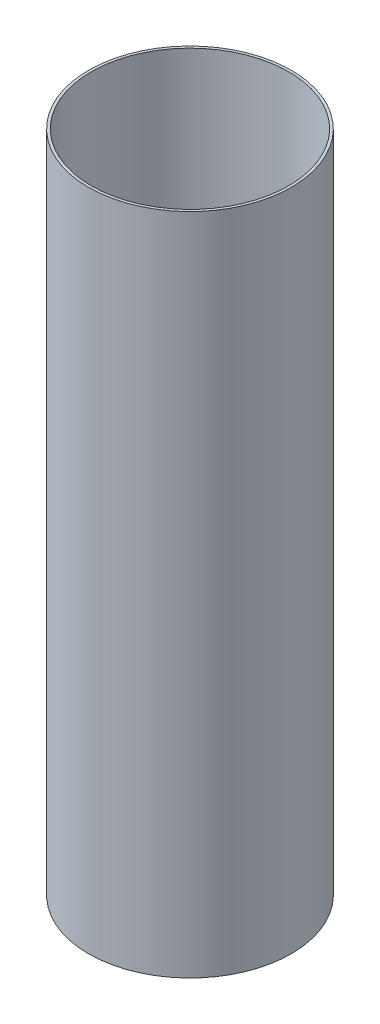
ISO-10303-21;
HEADER;
FILE_DESCRIPTION(('STEP AP214'),'2;1');
FILE_NAME('part.step','',(''),(''),'','','');
FILE_SCHEMA(('AUTOMOTIVE_DESIGN { 1 0 10303 214 1 1 1 1 }'));
ENDSEC;
DATA;
#1=APPLICATION_CONTEXT('core data for automotive mechanical design processes');
#2=APPLICATION_PROTOCOL_DEFINITION('international standard','automotive_design',2000,#1);
#3=PRODUCT_CONTEXT('',#1,'mechanical');
#4=PRODUCT('Part','Part','',(#3));
#5=PRODUCT_RELATED_PRODUCT_CATEGORY('part','',(#4));
#6=PRODUCT_DEFINITION_FORMATION('','',#4);
#7=PRODUCT_DEFINITION_CONTEXT('part definition',#1,'design');
#8=PRODUCT_DEFINITION('design','',#6,#7);
#9=PRODUCT_DEFINITION_SHAPE('','',#8);
#10=(LENGTH_UNIT() NAMED_UNIT(*) SI_UNIT(.MILLI.,.METRE.));
#11=(NAMED_UNIT(*) PLANE_ANGLE_UNIT() SI_UNIT($,.RADIAN.));
#12=(NAMED_UNIT(*) SI_UNIT($,.STERADIAN.) SOLID_ANGLE_UNIT());
#13=UNCERTAINTY_MEASURE_WITH_UNIT(LENGTH_MEASURE(1.E-05),#10,'distance_accuracy_value','');
#14=(GEOMETRIC_REPRESENTATION_CONTEXT(3) GLOBAL_UNCERTAINTY_ASSIGNED_CONTEXT((#13)) GLOBAL_UNIT_ASSIGNED_CONTEXT((#10,
#11,#12)) REPRESENTATION_CONTEXT('',''));
#15=CARTESIAN_POINT('',(0.,0.,0.));
#16=DIRECTION('',(0.,0.,1.));
#17=DIRECTION('',(1.,0.,0.));
#18=AXIS2_PLACEMENT_3D('',#15,#16,#17);
#19=CARTESIAN_POINT('',(0.,512.,0.));
#20=DIRECTION('',(0.,1.,0.));
#21=DIRECTION('',(0.,0.,1.));
#22=AXIS2_PLACEMENT_3D('',#19,#20,#21);
#23=PLANE('',#22);
#24=CARTESIAN_POINT('',(0.,512.,0.));
#25=DIRECTION('',(0.,1.,0.));
#26=DIRECTION('',(0.,0.,1.));
#27=AXIS2_PLACEMENT_3D('',#24,#25,#26);
#28=CIRCLE('',#27,78.2);
#29=CARTESIAN_POINT('',(0.,512.,78.2));
#30=VERTEX_POINT('',#29);
#31=EDGE_CURVE('E10',#30,#30,#28,.T.);
#32=ORIENTED_EDGE('',*,*,#31,.T.);
#33=EDGE_LOOP('',(#32));
#34=FACE_BOUND('',#33,.T.);
#35=CARTESIAN_POINT('',(0.,512.,0.));
#36=DIRECTION('',(0.,1.,0.));
#37=DIRECTION('',(0.,0.,1.));
#38=AXIS2_PLACEMENT_3D('',#35,#36,#37);
#39=CIRCLE('',#38,76.2);
#40=CARTESIAN_POINT('',(0.,512.,76.2));
#41=VERTEX_POINT('',#40);
#42=EDGE_CURVE('E50',#41,#41,#39,.T.);
#43=ORIENTED_EDGE('',*,*,#42,.F.);
#44=EDGE_LOOP('',(#43));
#45=FACE_BOUND('',#44,.T.);
#46=ADVANCED_FACE('F37',(#34,#45),#23,.T.);
#47=CARTESIAN_POINT('',(0.,0.,0.));
#48=DIRECTION('',(0.,1.,0.));
#49=DIRECTION('',(0.,0.,1.));
#50=AXIS2_PLACEMENT_3D('',#47,#48,#49);
#51=PLANE('',#50);
#52=CARTESIAN_POINT('',(0.,0.,0.));
#53=DIRECTION('',(0.,1.,0.));
#54=DIRECTION('',(0.,0.,1.));
#55=AXIS2_PLACEMENT_3D('',#52,#53,#54);
#56=CIRCLE('',#55,78.2);
#57=CARTESIAN_POINT('',(0.,0.,78.2));
#58=VERTEX_POINT('',#57);
#59=EDGE_CURVE('E41',#58,#58,#56,.T.);
#60=ORIENTED_EDGE('',*,*,#59,.F.);
#61=EDGE_LOOP('',(#60));
#62=FACE_BOUND('',#61,.T.);
#63=CARTESIAN_POINT('',(0.,0.,0.));
#64=DIRECTION('',(0.,1.,0.));
#65=DIRECTION('',(0.,0.,1.));
#66=AXIS2_PLACEMENT_3D('',#63,#64,#65);
#67=CIRCLE('',#66,76.2);
#68=CARTESIAN_POINT('',(0.,0.,76.2));
#69=VERTEX_POINT('',#68);
#70=EDGE_CURVE('E52',#69,#69,#67,.T.);
#71=ORIENTED_EDGE('',*,*,#70,.T.);
#72=EDGE_LOOP('',(#71));
#73=FACE_BOUND('',#72,.T.);
#74=ADVANCED_FACE('F64',(#62,#73),#51,.F.);
#75=CARTESIAN_POINT('',(0.,512.,0.));
#76=DIRECTION('',(0.,-1.,0.));
#77=DIRECTION('',(0.,0.,-1.));
#78=AXIS2_PLACEMENT_3D('',#75,#76,#77);
#79=CYLINDRICAL_SURFACE('',#78,78.2);
#80=ORIENTED_EDGE('',*,*,#31,.F.);
#81=EDGE_LOOP('',(#80));
#82=FACE_BOUND('',#81,.T.);
#83=ORIENTED_EDGE('',*,*,#59,.T.);
#84=EDGE_LOOP('',(#83));
#85=FACE_BOUND('',#84,.T.);
#86=ADVANCED_FACE('F39',(#82,#85),#79,.T.);
#87=CARTESIAN_POINT('',(0.,512.,0.));
#88=DIRECTION('',(0.,-1.,0.));
#89=DIRECTION('',(0.,0.,-1.));
#90=AXIS2_PLACEMENT_3D('',#87,#88,#89);
#91=CYLINDRICAL_SURFACE('',#90,76.2);
#92=ORIENTED_EDGE('',*,*,#42,.T.);
#93=EDGE_LOOP('',(#92));
#94=FACE_BOUND('',#93,.T.);
#95=ORIENTED_EDGE('',*,*,#70,.F.);
#96=EDGE_LOOP('',(#95));
#97=FACE_BOUND('',#96,.T.);
#98=ADVANCED_FACE('F60',(#94,#97),#91,.F.);
#99=CLOSED_SHELL('',(#46,#74,#86,#98));
#100=MANIFOLD_SOLID_BREP('B2',#99);
#101=ADVANCED_BREP_SHAPE_REPRESENTATION('',(#18,#100),#14);
#102=SHAPE_DEFINITION_REPRESENTATION(#9,#101);
ENDSEC;
END-ISO-10303-21;
